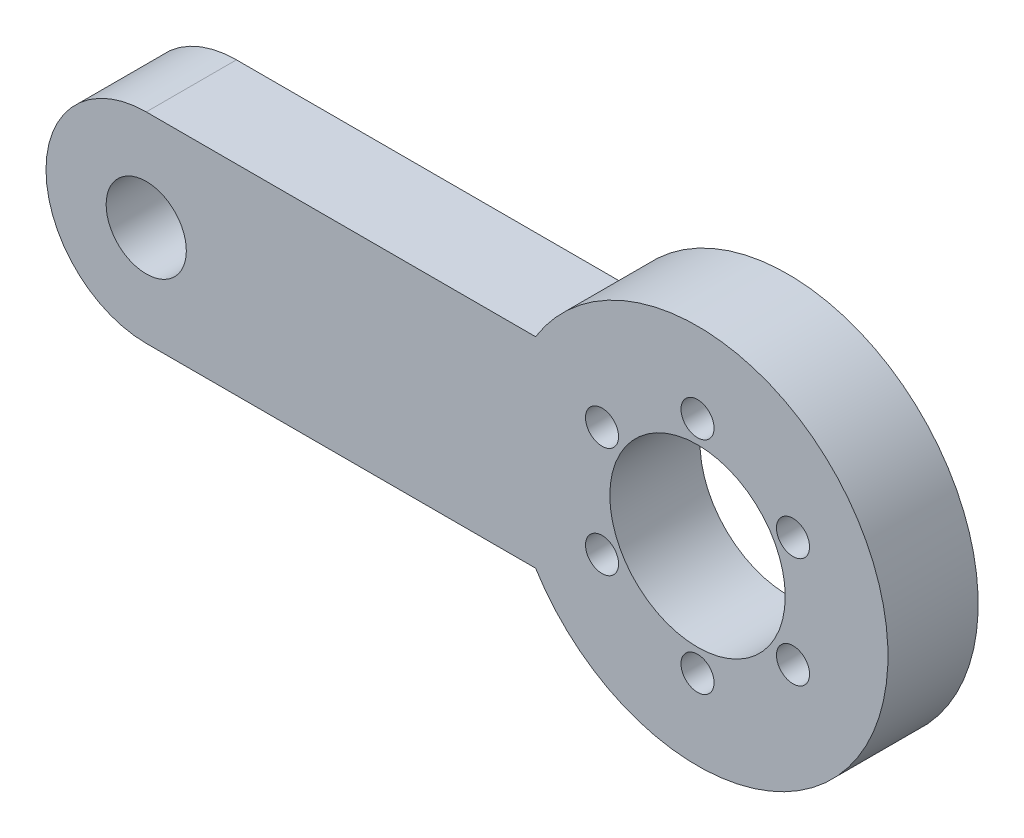
ISO-10303-21;
HEADER;
FILE_DESCRIPTION(('STEP AP214'),'2;1');
FILE_NAME('part.step','',(''),(''),'','','');
FILE_SCHEMA(('AUTOMOTIVE_DESIGN { 1 0 10303 214 1 1 1 1 }'));
ENDSEC;
DATA;
#1=APPLICATION_CONTEXT('core data for automotive mechanical design processes');
#2=APPLICATION_PROTOCOL_DEFINITION('international standard','automotive_design',2000,#1);
#3=PRODUCT_CONTEXT('',#1,'mechanical');
#4=PRODUCT('Part','Part','',(#3));
#5=PRODUCT_RELATED_PRODUCT_CATEGORY('part','',(#4));
#6=PRODUCT_DEFINITION_FORMATION('','',#4);
#7=PRODUCT_DEFINITION_CONTEXT('part definition',#1,'design');
#8=PRODUCT_DEFINITION('design','',#6,#7);
#9=PRODUCT_DEFINITION_SHAPE('','',#8);
#10=(LENGTH_UNIT() NAMED_UNIT(*) SI_UNIT(.MILLI.,.METRE.));
#11=(NAMED_UNIT(*) PLANE_ANGLE_UNIT() SI_UNIT($,.RADIAN.));
#12=(NAMED_UNIT(*) SI_UNIT($,.STERADIAN.) SOLID_ANGLE_UNIT());
#13=UNCERTAINTY_MEASURE_WITH_UNIT(LENGTH_MEASURE(1.E-05),#10,'distance_accuracy_value','');
#14=(GEOMETRIC_REPRESENTATION_CONTEXT(3) GLOBAL_UNCERTAINTY_ASSIGNED_CONTEXT((#13)) GLOBAL_UNIT_ASSIGNED_CONTEXT((#10,
#11,#12)) REPRESENTATION_CONTEXT('',''));
#15=CARTESIAN_POINT('',(0.,0.,0.));
#16=DIRECTION('',(0.,0.,1.));
#17=DIRECTION('',(1.,0.,0.));
#18=AXIS2_PLACEMENT_3D('',#15,#16,#17);
#19=CARTESIAN_POINT('',(0.,0.,9.));
#20=DIRECTION('',(0.,1.,0.));
#21=DIRECTION('',(0.,0.,1.));
#22=AXIS2_PLACEMENT_3D('',#19,#20,#21);
#23=PLANE('',#22);
#24=DIRECTION('',(1.,0.,0.));
#25=VECTOR('',#24,1.);
#26=CARTESIAN_POINT('',(0.,0.,0.));
#27=LINE('',#26,#25);
#28=CARTESIAN_POINT('',(10.,0.,0.));
#29=VERTEX_POINT('',#28);
#30=CARTESIAN_POINT('',(48.8445055785965,0.,0.));
#31=VERTEX_POINT('',#30);
#32=EDGE_CURVE('E106',#29,#31,#27,.T.);
#33=ORIENTED_EDGE('',*,*,#32,.T.);
#34=DIRECTION('',(0.,0.,1.));
#35=VECTOR('',#34,1.);
#36=CARTESIAN_POINT('',(48.8445055785965,0.,0.));
#37=LINE('',#36,#35);
#38=CARTESIAN_POINT('',(48.8445055785965,0.,9.));
#39=VERTEX_POINT('',#38);
#40=EDGE_CURVE('E87',#31,#39,#37,.T.);
#41=ORIENTED_EDGE('',*,*,#40,.T.);
#42=DIRECTION('',(1.,0.,0.));
#43=VECTOR('',#42,1.);
#44=CARTESIAN_POINT('',(0.,0.,9.));
#45=LINE('',#44,#43);
#46=CARTESIAN_POINT('',(10.,0.,9.));
#47=VERTEX_POINT('',#46);
#48=EDGE_CURVE('E93',#47,#39,#45,.T.);
#49=ORIENTED_EDGE('',*,*,#48,.F.);
#50=DIRECTION('',(0.,0.,-1.));
#51=VECTOR('',#50,1.);
#52=CARTESIAN_POINT('',(10.,0.,9.));
#53=LINE('',#52,#51);
#54=EDGE_CURVE('E97',#47,#29,#53,.T.);
#55=ORIENTED_EDGE('',*,*,#54,.T.);
#56=EDGE_LOOP('',(#33,#41,#49,#55));
#57=FACE_BOUND('',#56,.T.);
#58=ADVANCED_FACE('F33',(#57),#23,.F.);
#59=CARTESIAN_POINT('',(0.,20.,9.));
#60=DIRECTION('',(0.,-1.,0.));
#61=DIRECTION('',(0.,0.,-1.));
#62=AXIS2_PLACEMENT_3D('',#59,#60,#61);
#63=PLANE('',#62);
#64=DIRECTION('',(-1.,0.,0.));
#65=VECTOR('',#64,1.);
#66=CARTESIAN_POINT('',(0.,20.,9.));
#67=LINE('',#66,#65);
#68=CARTESIAN_POINT('',(48.8445055785965,20.,9.));
#69=VERTEX_POINT('',#68);
#70=CARTESIAN_POINT('',(10.,20.,9.));
#71=VERTEX_POINT('',#70);
#72=EDGE_CURVE('E49',#69,#71,#67,.T.);
#73=ORIENTED_EDGE('',*,*,#72,.F.);
#74=DIRECTION('',(0.,0.,1.));
#75=VECTOR('',#74,1.);
#76=CARTESIAN_POINT('',(48.8445055785965,20.,0.));
#77=LINE('',#76,#75);
#78=CARTESIAN_POINT('',(48.8445055785965,20.,0.));
#79=VERTEX_POINT('',#78);
#80=EDGE_CURVE('E79',#69,#79,#77,.F.);
#81=ORIENTED_EDGE('',*,*,#80,.T.);
#82=DIRECTION('',(-1.,0.,0.));
#83=VECTOR('',#82,1.);
#84=CARTESIAN_POINT('',(0.,20.,0.));
#85=LINE('',#84,#83);
#86=CARTESIAN_POINT('',(10.,20.,0.));
#87=VERTEX_POINT('',#86);
#88=EDGE_CURVE('E102',#79,#87,#85,.T.);
#89=ORIENTED_EDGE('',*,*,#88,.T.);
#90=DIRECTION('',(0.,0.,-1.));
#91=VECTOR('',#90,1.);
#92=CARTESIAN_POINT('',(10.,20.,9.));
#93=LINE('',#92,#91);
#94=EDGE_CURVE('E11',#87,#71,#93,.F.);
#95=ORIENTED_EDGE('',*,*,#94,.T.);
#96=EDGE_LOOP('',(#73,#81,#89,#95));
#97=FACE_BOUND('',#96,.T.);
#98=ADVANCED_FACE('F95',(#97),#63,.F.);
#99=CARTESIAN_POINT('',(0.,0.,9.));
#100=DIRECTION('',(0.,0.,-1.));
#101=DIRECTION('',(-1.,0.,0.));
#102=AXIS2_PLACEMENT_3D('',#99,#100,#101);
#103=PLANE('',#102);
#104=ORIENTED_EDGE('',*,*,#48,.T.);
#105=CARTESIAN_POINT('',(65.,10.,9.));
#106=DIRECTION('',(0.,0.,1.));
#107=DIRECTION('',(1.,0.,0.));
#108=AXIS2_PLACEMENT_3D('',#105,#106,#107);
#109=CIRCLE('',#108,19.);
#110=EDGE_CURVE('E81',#39,#69,#109,.T.);
#111=ORIENTED_EDGE('',*,*,#110,.T.);
#112=ORIENTED_EDGE('',*,*,#72,.T.);
#113=CARTESIAN_POINT('',(10.,10.,9.));
#114=DIRECTION('',(0.,0.,-1.));
#115=DIRECTION('',(-1.,0.,0.));
#116=AXIS2_PLACEMENT_3D('',#113,#114,#115);
#117=CIRCLE('',#116,10.);
#118=CARTESIAN_POINT('',(0.,10.,9.));
#119=VERTEX_POINT('',#118);
#120=EDGE_CURVE('E53',#71,#119,#117,.F.);
#121=ORIENTED_EDGE('',*,*,#120,.T.);
#122=CARTESIAN_POINT('',(10.,10.,9.));
#123=DIRECTION('',(0.,0.,-1.));
#124=DIRECTION('',(-1.,0.,0.));
#125=AXIS2_PLACEMENT_3D('',#122,#123,#124);
#126=CIRCLE('',#125,10.);
#127=EDGE_CURVE('E42',#119,#47,#126,.F.);
#128=ORIENTED_EDGE('',*,*,#127,.T.);
#129=EDGE_LOOP('',(#104,#111,#112,#121,#128));
#130=FACE_BOUND('',#129,.T.);
#131=CARTESIAN_POINT('',(10.,10.,9.));
#132=DIRECTION('',(0.,0.,-1.));
#133=DIRECTION('',(-1.,0.,0.));
#134=AXIS2_PLACEMENT_3D('',#131,#132,#133);
#135=CIRCLE('',#134,4.);
#136=CARTESIAN_POINT('',(6.,10.,9.));
#137=VERTEX_POINT('',#136);
#138=EDGE_CURVE('E130',#137,#137,#135,.T.);
#139=ORIENTED_EDGE('',*,*,#138,.T.);
#140=EDGE_LOOP('',(#139));
#141=FACE_BOUND('',#140,.T.);
#142=CARTESIAN_POINT('',(65.,10.,9.));
#143=DIRECTION('',(0.,0.,-1.));
#144=DIRECTION('',(-1.,0.,0.));
#145=AXIS2_PLACEMENT_3D('',#142,#143,#144);
#146=CIRCLE('',#145,8.75);
#147=CARTESIAN_POINT('',(56.25,10.,9.));
#148=VERTEX_POINT('',#147);
#149=EDGE_CURVE('E109',#148,#148,#146,.T.);
#150=ORIENTED_EDGE('',*,*,#149,.T.);
#151=EDGE_LOOP('',(#150));
#152=FACE_BOUND('',#151,.T.);
#153=CARTESIAN_POINT('',(65.,-0.999999999999996,9.));
#154=DIRECTION('',(0.,0.,-1.));
#155=DIRECTION('',(-1.,0.,0.));
#156=AXIS2_PLACEMENT_3D('',#153,#154,#155);
#157=CIRCLE('',#156,1.65);
#158=CARTESIAN_POINT('',(63.35,-0.999999999999996,9.));
#159=VERTEX_POINT('',#158);
#160=EDGE_CURVE('E149',#159,#159,#157,.T.);
#161=ORIENTED_EDGE('',*,*,#160,.T.);
#162=EDGE_LOOP('',(#161));
#163=FACE_BOUND('',#162,.T.);
#164=CARTESIAN_POINT('',(55.4737205583712,4.5,9.));
#165=DIRECTION('',(0.,0.,-1.));
#166=DIRECTION('',(-1.,0.,0.));
#167=AXIS2_PLACEMENT_3D('',#164,#165,#166);
#168=CIRCLE('',#167,1.64999999999999);
#169=CARTESIAN_POINT('',(53.8237205583712,4.5,9.));
#170=VERTEX_POINT('',#169);
#171=EDGE_CURVE('E157',#170,#170,#168,.T.);
#172=ORIENTED_EDGE('',*,*,#171,.T.);
#173=EDGE_LOOP('',(#172));
#174=FACE_BOUND('',#173,.T.);
#175=CARTESIAN_POINT('',(55.4737205583712,15.5,9.));
#176=DIRECTION('',(0.,0.,-1.));
#177=DIRECTION('',(-1.,0.,0.));
#178=AXIS2_PLACEMENT_3D('',#175,#176,#177);
#179=CIRCLE('',#178,1.65);
#180=CARTESIAN_POINT('',(53.8237205583712,15.5,9.));
#181=VERTEX_POINT('',#180);
#182=EDGE_CURVE('E160',#181,#181,#179,.T.);
#183=ORIENTED_EDGE('',*,*,#182,.T.);
#184=EDGE_LOOP('',(#183));
#185=FACE_BOUND('',#184,.T.);
#186=CARTESIAN_POINT('',(65.,21.,9.));
#187=DIRECTION('',(0.,0.,-1.));
#188=DIRECTION('',(-1.,0.,0.));
#189=AXIS2_PLACEMENT_3D('',#186,#187,#188);
#190=CIRCLE('',#189,1.65000000000002);
#191=CARTESIAN_POINT('',(63.35,21.,9.));
#192=VERTEX_POINT('',#191);
#193=EDGE_CURVE('E163',#192,#192,#190,.T.);
#194=ORIENTED_EDGE('',*,*,#193,.T.);
#195=EDGE_LOOP('',(#194));
#196=FACE_BOUND('',#195,.T.);
#197=CARTESIAN_POINT('',(74.5262794416288,15.5,9.));
#198=DIRECTION('',(0.,0.,-1.));
#199=DIRECTION('',(-1.,0.,0.));
#200=AXIS2_PLACEMENT_3D('',#197,#198,#199);
#201=CIRCLE('',#200,1.65000000000002);
#202=CARTESIAN_POINT('',(72.8762794416288,15.5,9.));
#203=VERTEX_POINT('',#202);
#204=EDGE_CURVE('E166',#203,#203,#201,.T.);
#205=ORIENTED_EDGE('',*,*,#204,.T.);
#206=EDGE_LOOP('',(#205));
#207=FACE_BOUND('',#206,.T.);
#208=CARTESIAN_POINT('',(74.5262794416288,4.50000000000001,9.));
#209=DIRECTION('',(0.,0.,-1.));
#210=DIRECTION('',(-1.,0.,0.));
#211=AXIS2_PLACEMENT_3D('',#208,#209,#210);
#212=CIRCLE('',#211,1.65);
#213=CARTESIAN_POINT('',(72.8762794416288,4.50000000000001,9.));
#214=VERTEX_POINT('',#213);
#215=EDGE_CURVE('E169',#214,#214,#212,.T.);
#216=ORIENTED_EDGE('',*,*,#215,.T.);
#217=EDGE_LOOP('',(#216));
#218=FACE_BOUND('',#217,.T.);
#219=ADVANCED_FACE('F90',(#130,#141,#152,#163,#174,#185,#196,#207,#218),#103,.F.);
#220=CARTESIAN_POINT('',(0.,0.,0.));
#221=DIRECTION('',(0.,0.,-1.));
#222=DIRECTION('',(-1.,0.,0.));
#223=AXIS2_PLACEMENT_3D('',#220,#221,#222);
#224=PLANE('',#223);
#225=ORIENTED_EDGE('',*,*,#88,.F.);
#226=CARTESIAN_POINT('',(65.,10.,0.));
#227=DIRECTION('',(0.,0.,1.));
#228=DIRECTION('',(1.,0.,0.));
#229=AXIS2_PLACEMENT_3D('',#226,#227,#228);
#230=CIRCLE('',#229,19.);
#231=EDGE_CURVE('E84',#31,#79,#230,.T.);
#232=ORIENTED_EDGE('',*,*,#231,.F.);
#233=ORIENTED_EDGE('',*,*,#32,.F.);
#234=CARTESIAN_POINT('',(10.,10.,0.));
#235=DIRECTION('',(0.,0.,-1.));
#236=DIRECTION('',(-1.,0.,0.));
#237=AXIS2_PLACEMENT_3D('',#234,#235,#236);
#238=CIRCLE('',#237,10.);
#239=CARTESIAN_POINT('',(0.,10.,0.));
#240=VERTEX_POINT('',#239);
#241=EDGE_CURVE('E113',#29,#240,#238,.T.);
#242=ORIENTED_EDGE('',*,*,#241,.T.);
#243=CARTESIAN_POINT('',(10.,10.,0.));
#244=DIRECTION('',(0.,0.,-1.));
#245=DIRECTION('',(-1.,0.,0.));
#246=AXIS2_PLACEMENT_3D('',#243,#244,#245);
#247=CIRCLE('',#246,10.);
#248=EDGE_CURVE('E100',#240,#87,#247,.T.);
#249=ORIENTED_EDGE('',*,*,#248,.T.);
#250=EDGE_LOOP('',(#225,#232,#233,#242,#249));
#251=FACE_BOUND('',#250,.T.);
#252=CARTESIAN_POINT('',(10.,10.,0.));
#253=DIRECTION('',(0.,0.,1.));
#254=DIRECTION('',(1.,0.,0.));
#255=AXIS2_PLACEMENT_3D('',#252,#253,#254);
#256=CIRCLE('',#255,4.);
#257=CARTESIAN_POINT('',(14.,10.,0.));
#258=VERTEX_POINT('',#257);
#259=EDGE_CURVE('E128',#258,#258,#256,.T.);
#260=ORIENTED_EDGE('',*,*,#259,.T.);
#261=EDGE_LOOP('',(#260));
#262=FACE_BOUND('',#261,.T.);
#263=CARTESIAN_POINT('',(65.,10.,0.));
#264=DIRECTION('',(0.,0.,1.));
#265=DIRECTION('',(1.,0.,0.));
#266=AXIS2_PLACEMENT_3D('',#263,#264,#265);
#267=CIRCLE('',#266,8.75);
#268=CARTESIAN_POINT('',(73.75,10.,0.));
#269=VERTEX_POINT('',#268);
#270=EDGE_CURVE('E172',#269,#269,#267,.T.);
#271=ORIENTED_EDGE('',*,*,#270,.T.);
#272=EDGE_LOOP('',(#271));
#273=FACE_BOUND('',#272,.T.);
#274=CARTESIAN_POINT('',(65.,-0.999999999999996,0.));
#275=DIRECTION('',(0.,0.,1.));
#276=DIRECTION('',(1.,0.,0.));
#277=AXIS2_PLACEMENT_3D('',#274,#275,#276);
#278=CIRCLE('',#277,1.65);
#279=CARTESIAN_POINT('',(66.65,-0.999999999999996,0.));
#280=VERTEX_POINT('',#279);
#281=EDGE_CURVE('E146',#280,#280,#278,.T.);
#282=ORIENTED_EDGE('',*,*,#281,.T.);
#283=EDGE_LOOP('',(#282));
#284=FACE_BOUND('',#283,.T.);
#285=CARTESIAN_POINT('',(55.4737205583712,4.5,0.));
#286=DIRECTION('',(0.,0.,1.));
#287=DIRECTION('',(1.,0.,0.));
#288=AXIS2_PLACEMENT_3D('',#285,#286,#287);
#289=CIRCLE('',#288,1.64999999999999);
#290=CARTESIAN_POINT('',(57.1237205583712,4.5,0.));
#291=VERTEX_POINT('',#290);
#292=EDGE_CURVE('E150',#291,#291,#289,.T.);
#293=ORIENTED_EDGE('',*,*,#292,.T.);
#294=EDGE_LOOP('',(#293));
#295=FACE_BOUND('',#294,.T.);
#296=CARTESIAN_POINT('',(55.4737205583712,15.5,0.));
#297=DIRECTION('',(0.,0.,1.));
#298=DIRECTION('',(1.,0.,0.));
#299=AXIS2_PLACEMENT_3D('',#296,#297,#298);
#300=CIRCLE('',#299,1.65);
#301=CARTESIAN_POINT('',(57.1237205583712,15.5,0.));
#302=VERTEX_POINT('',#301);
#303=EDGE_CURVE('E140',#302,#302,#300,.T.);
#304=ORIENTED_EDGE('',*,*,#303,.T.);
#305=EDGE_LOOP('',(#304));
#306=FACE_BOUND('',#305,.T.);
#307=CARTESIAN_POINT('',(65.,21.,0.));
#308=DIRECTION('',(0.,0.,1.));
#309=DIRECTION('',(1.,0.,0.));
#310=AXIS2_PLACEMENT_3D('',#307,#308,#309);
#311=CIRCLE('',#310,1.65000000000002);
#312=CARTESIAN_POINT('',(66.65,21.,0.));
#313=VERTEX_POINT('',#312);
#314=EDGE_CURVE('E137',#313,#313,#311,.T.);
#315=ORIENTED_EDGE('',*,*,#314,.T.);
#316=EDGE_LOOP('',(#315));
#317=FACE_BOUND('',#316,.T.);
#318=CARTESIAN_POINT('',(74.5262794416288,15.5,0.));
#319=DIRECTION('',(0.,0.,1.));
#320=DIRECTION('',(1.,0.,0.));
#321=AXIS2_PLACEMENT_3D('',#318,#319,#320);
#322=CIRCLE('',#321,1.65000000000002);
#323=CARTESIAN_POINT('',(76.1762794416288,15.5,0.));
#324=VERTEX_POINT('',#323);
#325=EDGE_CURVE('E141',#324,#324,#322,.T.);
#326=ORIENTED_EDGE('',*,*,#325,.T.);
#327=EDGE_LOOP('',(#326));
#328=FACE_BOUND('',#327,.T.);
#329=CARTESIAN_POINT('',(74.5262794416288,4.50000000000001,0.));
#330=DIRECTION('',(0.,0.,1.));
#331=DIRECTION('',(1.,0.,0.));
#332=AXIS2_PLACEMENT_3D('',#329,#330,#331);
#333=CIRCLE('',#332,1.65);
#334=CARTESIAN_POINT('',(76.1762794416288,4.50000000000001,0.));
#335=VERTEX_POINT('',#334);
#336=EDGE_CURVE('E136',#335,#335,#333,.T.);
#337=ORIENTED_EDGE('',*,*,#336,.T.);
#338=EDGE_LOOP('',(#337));
#339=FACE_BOUND('',#338,.T.);
#340=ADVANCED_FACE('F125',(#251,#262,#273,#284,#295,#306,#317,#328,#339),#224,.T.);
#341=CARTESIAN_POINT('',(65.,10.,0.));
#342=DIRECTION('',(0.,0.,1.));
#343=DIRECTION('',(1.,0.,0.));
#344=AXIS2_PLACEMENT_3D('',#341,#342,#343);
#345=CYLINDRICAL_SURFACE('',#344,8.75);
#346=ORIENTED_EDGE('',*,*,#270,.F.);
#347=EDGE_LOOP('',(#346));
#348=FACE_BOUND('',#347,.T.);
#349=ORIENTED_EDGE('',*,*,#149,.F.);
#350=EDGE_LOOP('',(#349));
#351=FACE_BOUND('',#350,.T.);
#352=ADVANCED_FACE('F179',(#348,#351),#345,.F.);
#353=CARTESIAN_POINT('',(65.,-0.999999999999996,0.));
#354=DIRECTION('',(0.,0.,1.));
#355=DIRECTION('',(1.,0.,0.));
#356=AXIS2_PLACEMENT_3D('',#353,#354,#355);
#357=CYLINDRICAL_SURFACE('',#356,1.65);
#358=ORIENTED_EDGE('',*,*,#281,.F.);
#359=EDGE_LOOP('',(#358));
#360=FACE_BOUND('',#359,.T.);
#361=ORIENTED_EDGE('',*,*,#160,.F.);
#362=EDGE_LOOP('',(#361));
#363=FACE_BOUND('',#362,.T.);
#364=ADVANCED_FACE('F181',(#360,#363),#357,.F.);
#365=CARTESIAN_POINT('',(55.4737205583712,4.5,0.));
#366=DIRECTION('',(0.,0.,1.));
#367=DIRECTION('',(1.,0.,0.));
#368=AXIS2_PLACEMENT_3D('',#365,#366,#367);
#369=CYLINDRICAL_SURFACE('',#368,1.64999999999999);
#370=ORIENTED_EDGE('',*,*,#292,.F.);
#371=EDGE_LOOP('',(#370));
#372=FACE_BOUND('',#371,.T.);
#373=ORIENTED_EDGE('',*,*,#171,.F.);
#374=EDGE_LOOP('',(#373));
#375=FACE_BOUND('',#374,.T.);
#376=ADVANCED_FACE('F188',(#372,#375),#369,.F.);
#377=CARTESIAN_POINT('',(55.4737205583712,15.5,0.));
#378=DIRECTION('',(0.,0.,1.));
#379=DIRECTION('',(1.,0.,0.));
#380=AXIS2_PLACEMENT_3D('',#377,#378,#379);
#381=CYLINDRICAL_SURFACE('',#380,1.65);
#382=ORIENTED_EDGE('',*,*,#303,.F.);
#383=EDGE_LOOP('',(#382));
#384=FACE_BOUND('',#383,.T.);
#385=ORIENTED_EDGE('',*,*,#182,.F.);
#386=EDGE_LOOP('',(#385));
#387=FACE_BOUND('',#386,.T.);
#388=ADVANCED_FACE('F226',(#384,#387),#381,.F.);
#389=CARTESIAN_POINT('',(65.,21.,0.));
#390=DIRECTION('',(0.,0.,1.));
#391=DIRECTION('',(1.,0.,0.));
#392=AXIS2_PLACEMENT_3D('',#389,#390,#391);
#393=CYLINDRICAL_SURFACE('',#392,1.65000000000002);
#394=ORIENTED_EDGE('',*,*,#314,.F.);
#395=EDGE_LOOP('',(#394));
#396=FACE_BOUND('',#395,.T.);
#397=ORIENTED_EDGE('',*,*,#193,.F.);
#398=EDGE_LOOP('',(#397));
#399=FACE_BOUND('',#398,.T.);
#400=ADVANCED_FACE('F223',(#396,#399),#393,.F.);
#401=CARTESIAN_POINT('',(74.5262794416288,15.5,0.));
#402=DIRECTION('',(0.,0.,1.));
#403=DIRECTION('',(1.,0.,0.));
#404=AXIS2_PLACEMENT_3D('',#401,#402,#403);
#405=CYLINDRICAL_SURFACE('',#404,1.65000000000002);
#406=ORIENTED_EDGE('',*,*,#325,.F.);
#407=EDGE_LOOP('',(#406));
#408=FACE_BOUND('',#407,.T.);
#409=ORIENTED_EDGE('',*,*,#204,.F.);
#410=EDGE_LOOP('',(#409));
#411=FACE_BOUND('',#410,.T.);
#412=ADVANCED_FACE('F217',(#408,#411),#405,.F.);
#413=CARTESIAN_POINT('',(74.5262794416288,4.50000000000001,0.));
#414=DIRECTION('',(0.,0.,1.));
#415=DIRECTION('',(1.,0.,0.));
#416=AXIS2_PLACEMENT_3D('',#413,#414,#415);
#417=CYLINDRICAL_SURFACE('',#416,1.65);
#418=ORIENTED_EDGE('',*,*,#336,.F.);
#419=EDGE_LOOP('',(#418));
#420=FACE_BOUND('',#419,.T.);
#421=ORIENTED_EDGE('',*,*,#215,.F.);
#422=EDGE_LOOP('',(#421));
#423=FACE_BOUND('',#422,.T.);
#424=ADVANCED_FACE('F211',(#420,#423),#417,.F.);
#425=CARTESIAN_POINT('',(10.,10.,0.));
#426=DIRECTION('',(0.,0.,1.));
#427=DIRECTION('',(1.,0.,0.));
#428=AXIS2_PLACEMENT_3D('',#425,#426,#427);
#429=CYLINDRICAL_SURFACE('',#428,4.);
#430=ORIENTED_EDGE('',*,*,#259,.F.);
#431=EDGE_LOOP('',(#430));
#432=FACE_BOUND('',#431,.T.);
#433=ORIENTED_EDGE('',*,*,#138,.F.);
#434=EDGE_LOOP('',(#433));
#435=FACE_BOUND('',#434,.T.);
#436=ADVANCED_FACE('F207',(#432,#435),#429,.F.);
#437=CARTESIAN_POINT('',(10.,10.,9.));
#438=DIRECTION('',(0.,0.,-1.));
#439=DIRECTION('',(-1.,0.,0.));
#440=AXIS2_PLACEMENT_3D('',#437,#438,#439);
#441=CYLINDRICAL_SURFACE('',#440,10.);
#442=DIRECTION('',(0.,0.,-1.));
#443=VECTOR('',#442,1.);
#444=CARTESIAN_POINT('',(0.,10.,9.));
#445=LINE('',#444,#443);
#446=EDGE_CURVE('E37',#119,#240,#445,.T.);
#447=ORIENTED_EDGE('',*,*,#446,.F.);
#448=ORIENTED_EDGE('',*,*,#120,.F.);
#449=ORIENTED_EDGE('',*,*,#94,.F.);
#450=ORIENTED_EDGE('',*,*,#248,.F.);
#451=EDGE_LOOP('',(#447,#448,#449,#450));
#452=FACE_BOUND('',#451,.T.);
#453=ADVANCED_FACE('F35',(#452),#441,.T.);
#454=CARTESIAN_POINT('',(10.,10.,9.));
#455=DIRECTION('',(0.,0.,-1.));
#456=DIRECTION('',(-1.,0.,0.));
#457=AXIS2_PLACEMENT_3D('',#454,#455,#456);
#458=CYLINDRICAL_SURFACE('',#457,10.);
#459=ORIENTED_EDGE('',*,*,#127,.F.);
#460=ORIENTED_EDGE('',*,*,#446,.T.);
#461=ORIENTED_EDGE('',*,*,#241,.F.);
#462=ORIENTED_EDGE('',*,*,#54,.F.);
#463=EDGE_LOOP('',(#459,#460,#461,#462));
#464=FACE_BOUND('',#463,.T.);
#465=ADVANCED_FACE('F122',(#464),#458,.T.);
#466=CARTESIAN_POINT('',(65.,10.,0.));
#467=DIRECTION('',(0.,0.,1.));
#468=DIRECTION('',(1.,0.,0.));
#469=AXIS2_PLACEMENT_3D('',#466,#467,#468);
#470=CYLINDRICAL_SURFACE('',#469,19.);
#471=ORIENTED_EDGE('',*,*,#40,.F.);
#472=ORIENTED_EDGE('',*,*,#231,.T.);
#473=ORIENTED_EDGE('',*,*,#80,.F.);
#474=ORIENTED_EDGE('',*,*,#110,.F.);
#475=EDGE_LOOP('',(#471,#472,#473,#474));
#476=FACE_BOUND('',#475,.T.);
#477=ADVANCED_FACE('F80',(#476),#470,.T.);
#478=CLOSED_SHELL('',(#58,#98,#219,#340,#352,#364,#376,#388,#400,#412,#424,#436,#453,#465,#477));
#479=MANIFOLD_SOLID_BREP('B2',#478);
#480=ADVANCED_BREP_SHAPE_REPRESENTATION('',(#18,#479),#14);
#481=SHAPE_DEFINITION_REPRESENTATION(#9,#480);
ENDSEC;
END-ISO-10303-21;
